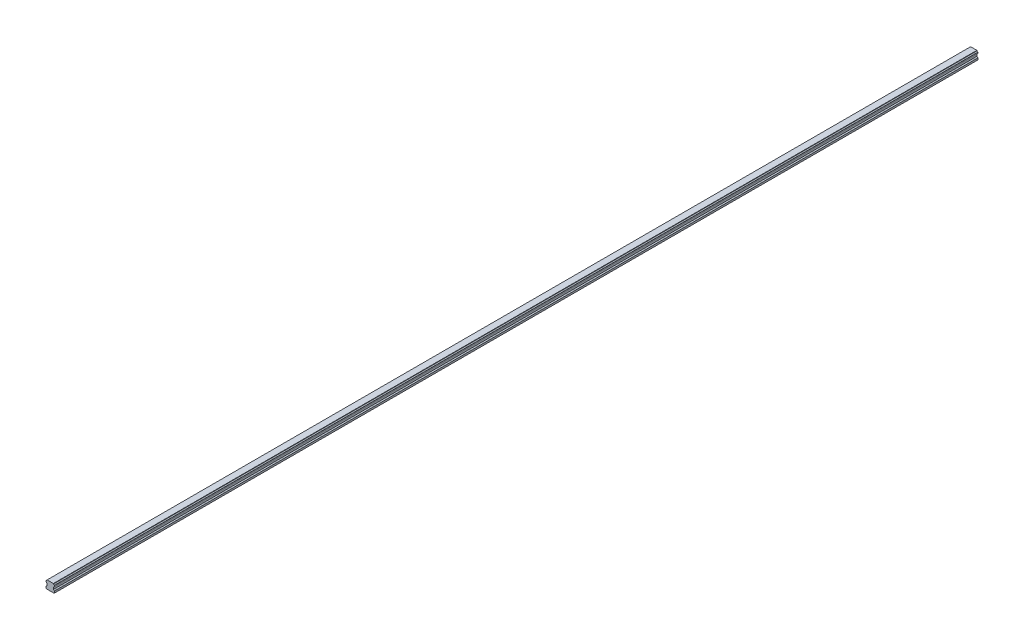
ISO-10303-21;
HEADER;
FILE_DESCRIPTION(('STEP AP214'),'2;1');
FILE_NAME('part.step','',(''),(''),'','','');
FILE_SCHEMA(('AUTOMOTIVE_DESIGN { 1 0 10303 214 1 1 1 1 }'));
ENDSEC;
DATA;
#1=APPLICATION_CONTEXT('core data for automotive mechanical design processes');
#2=APPLICATION_PROTOCOL_DEFINITION('international standard','automotive_design',2000,#1);
#3=PRODUCT_CONTEXT('',#1,'mechanical');
#4=PRODUCT('Part','Part','',(#3));
#5=PRODUCT_RELATED_PRODUCT_CATEGORY('part','',(#4));
#6=PRODUCT_DEFINITION_FORMATION('','',#4);
#7=PRODUCT_DEFINITION_CONTEXT('part definition',#1,'design');
#8=PRODUCT_DEFINITION('design','',#6,#7);
#9=PRODUCT_DEFINITION_SHAPE('','',#8);
#10=(LENGTH_UNIT() NAMED_UNIT(*) SI_UNIT(.MILLI.,.METRE.));
#11=(NAMED_UNIT(*) PLANE_ANGLE_UNIT() SI_UNIT($,.RADIAN.));
#12=(NAMED_UNIT(*) SI_UNIT($,.STERADIAN.) SOLID_ANGLE_UNIT());
#13=UNCERTAINTY_MEASURE_WITH_UNIT(LENGTH_MEASURE(1.E-05),#10,'distance_accuracy_value','');
#14=(GEOMETRIC_REPRESENTATION_CONTEXT(3) GLOBAL_UNCERTAINTY_ASSIGNED_CONTEXT((#13)) GLOBAL_UNIT_ASSIGNED_CONTEXT((#10,
#11,#12)) REPRESENTATION_CONTEXT('',''));
#15=CARTESIAN_POINT('',(0.,0.,0.));
#16=DIRECTION('',(0.,0.,1.));
#17=DIRECTION('',(1.,0.,0.));
#18=AXIS2_PLACEMENT_3D('',#15,#16,#17);
#19=CARTESIAN_POINT('',(11.4999999999682,2.31299423153181,-2500.));
#20=DIRECTION('',(0.,0.,1.));
#21=DIRECTION('',(1.,0.,0.));
#22=AXIS2_PLACEMENT_3D('',#19,#20,#21);
#23=CYLINDRICAL_SURFACE('',#22,2.5);
#24=CARTESIAN_POINT('',(11.4999999999682,2.31299423153181,0.));
#25=DIRECTION('',(0.,0.,-1.));
#26=DIRECTION('',(1.,0.,0.));
#27=AXIS2_PLACEMENT_3D('',#24,#25,#26);
#28=CIRCLE('',#27,2.5);
#29=CARTESIAN_POINT('',(9.0075845864,2.5075845864,0.));
#30=VERTEX_POINT('',#29);
#31=CARTESIAN_POINT('',(11.3054096451,4.8054096451,0.));
#32=VERTEX_POINT('',#31);
#33=EDGE_CURVE('E228',#30,#32,#28,.T.);
#34=ORIENTED_EDGE('',*,*,#33,.F.);
#35=DIRECTION('',(0.,0.,1.));
#36=VECTOR('',#35,1.);
#37=CARTESIAN_POINT('',(9.0075845864,2.5075845864,-2500.));
#38=LINE('',#37,#36);
#39=CARTESIAN_POINT('',(9.0075845864,2.5075845864,-2500.));
#40=VERTEX_POINT('',#39);
#41=EDGE_CURVE('E11',#40,#30,#38,.T.);
#42=ORIENTED_EDGE('',*,*,#41,.F.);
#43=CARTESIAN_POINT('',(11.4999999999682,2.31299423153181,-2500.));
#44=DIRECTION('',(0.,0.,-1.));
#45=DIRECTION('',(1.,0.,0.));
#46=AXIS2_PLACEMENT_3D('',#43,#44,#45);
#47=CIRCLE('',#46,2.5);
#48=CARTESIAN_POINT('',(11.3054096451,4.8054096451,-2500.));
#49=VERTEX_POINT('',#48);
#50=EDGE_CURVE('E296',#40,#49,#47,.T.);
#51=ORIENTED_EDGE('',*,*,#50,.T.);
#52=DIRECTION('',(0.,0.,1.));
#53=VECTOR('',#52,1.);
#54=CARTESIAN_POINT('',(11.3054096451,4.8054096451,-2500.));
#55=LINE('',#54,#53);
#56=EDGE_CURVE('E38',#49,#32,#55,.T.);
#57=ORIENTED_EDGE('',*,*,#56,.T.);
#58=EDGE_LOOP('',(#34,#42,#51,#57));
#59=FACE_BOUND('',#58,.T.);
#60=ADVANCED_FACE('F35',(#59),#23,.F.);
#61=CARTESIAN_POINT('',(8.5,2.,-2500.));
#62=DIRECTION('',(0.707106781186548,-0.707106781186547,0.));
#63=DIRECTION('',(0.707106781186547,0.707106781186548,0.));
#64=AXIS2_PLACEMENT_3D('',#61,#62,#63);
#65=PLANE('',#64);
#66=DIRECTION('',(0.707106781186547,0.707106781186548,0.));
#67=VECTOR('',#66,1.);
#68=CARTESIAN_POINT('',(8.5,2.,0.));
#69=LINE('',#68,#67);
#70=CARTESIAN_POINT('',(8.5,2.,0.));
#71=VERTEX_POINT('',#70);
#72=EDGE_CURVE('E294',#71,#30,#69,.T.);
#73=ORIENTED_EDGE('',*,*,#72,.F.);
#74=DIRECTION('',(0.,0.,1.));
#75=VECTOR('',#74,1.);
#76=CARTESIAN_POINT('',(8.5,2.,-2500.));
#77=LINE('',#76,#75);
#78=CARTESIAN_POINT('',(8.5,2.,-2500.));
#79=VERTEX_POINT('',#78);
#80=EDGE_CURVE('E44',#79,#71,#77,.T.);
#81=ORIENTED_EDGE('',*,*,#80,.F.);
#82=DIRECTION('',(0.707106781186547,0.707106781186548,0.));
#83=VECTOR('',#82,1.);
#84=CARTESIAN_POINT('',(8.5,2.,-2500.));
#85=LINE('',#84,#83);
#86=EDGE_CURVE('E218',#79,#40,#85,.T.);
#87=ORIENTED_EDGE('',*,*,#86,.T.);
#88=ORIENTED_EDGE('',*,*,#41,.T.);
#89=EDGE_LOOP('',(#73,#81,#87,#88));
#90=FACE_BOUND('',#89,.T.);
#91=ADVANCED_FACE('F340',(#90),#65,.T.);
#92=CARTESIAN_POINT('',(8.5,-3.,-2500.));
#93=DIRECTION('',(1.,0.,0.));
#94=DIRECTION('',(0.,0.,-1.));
#95=AXIS2_PLACEMENT_3D('',#92,#93,#94);
#96=PLANE('',#95);
#97=DIRECTION('',(0.,1.,0.));
#98=VECTOR('',#97,1.);
#99=CARTESIAN_POINT('',(8.5,-3.,0.));
#100=LINE('',#99,#98);
#101=CARTESIAN_POINT('',(8.5,-3.,0.));
#102=VERTEX_POINT('',#101);
#103=EDGE_CURVE('E205',#102,#71,#100,.T.);
#104=ORIENTED_EDGE('',*,*,#103,.F.);
#105=DIRECTION('',(0.,0.,1.));
#106=VECTOR('',#105,1.);
#107=CARTESIAN_POINT('',(8.5,-3.,-2500.));
#108=LINE('',#107,#106);
#109=CARTESIAN_POINT('',(8.5,-3.,-2500.));
#110=VERTEX_POINT('',#109);
#111=EDGE_CURVE('E200',#110,#102,#108,.T.);
#112=ORIENTED_EDGE('',*,*,#111,.F.);
#113=DIRECTION('',(0.,1.,0.));
#114=VECTOR('',#113,1.);
#115=CARTESIAN_POINT('',(8.5,-3.,-2500.));
#116=LINE('',#115,#114);
#117=EDGE_CURVE('E203',#110,#79,#116,.T.);
#118=ORIENTED_EDGE('',*,*,#117,.T.);
#119=ORIENTED_EDGE('',*,*,#80,.T.);
#120=EDGE_LOOP('',(#104,#112,#118,#119));
#121=FACE_BOUND('',#120,.T.);
#122=ADVANCED_FACE('F202',(#121),#96,.T.);
#123=CARTESIAN_POINT('',(11.5,-5.,-2500.));
#124=DIRECTION('',(0.554700196225229,0.832050294337844,0.));
#125=DIRECTION('',(-0.832050294337844,0.554700196225229,0.));
#126=AXIS2_PLACEMENT_3D('',#123,#124,#125);
#127=PLANE('',#126);
#128=DIRECTION('',(-0.832050294337844,0.554700196225229,0.));
#129=VECTOR('',#128,1.);
#130=CARTESIAN_POINT('',(11.5,-5.,0.));
#131=LINE('',#130,#129);
#132=CARTESIAN_POINT('',(11.5,-5.,0.));
#133=VERTEX_POINT('',#132);
#134=EDGE_CURVE('E291',#133,#102,#131,.T.);
#135=ORIENTED_EDGE('',*,*,#134,.F.);
#136=DIRECTION('',(0.,0.,1.));
#137=VECTOR('',#136,1.);
#138=CARTESIAN_POINT('',(11.5,-5.,-2500.));
#139=LINE('',#138,#137);
#140=CARTESIAN_POINT('',(11.5,-5.,-2500.));
#141=VERTEX_POINT('',#140);
#142=EDGE_CURVE('E210',#141,#133,#139,.T.);
#143=ORIENTED_EDGE('',*,*,#142,.F.);
#144=DIRECTION('',(-0.832050294337844,0.554700196225229,0.));
#145=VECTOR('',#144,1.);
#146=CARTESIAN_POINT('',(11.5,-5.,-2500.));
#147=LINE('',#146,#145);
#148=EDGE_CURVE('E216',#141,#110,#147,.T.);
#149=ORIENTED_EDGE('',*,*,#148,.T.);
#150=ORIENTED_EDGE('',*,*,#111,.T.);
#151=EDGE_LOOP('',(#135,#143,#149,#150));
#152=FACE_BOUND('',#151,.T.);
#153=ADVANCED_FACE('F220',(#152),#127,.T.);
#154=CARTESIAN_POINT('',(11.5,-10.,-2500.));
#155=DIRECTION('',(1.,0.,0.));
#156=DIRECTION('',(0.,0.,-1.));
#157=AXIS2_PLACEMENT_3D('',#154,#155,#156);
#158=PLANE('',#157);
#159=DIRECTION('',(0.,1.,0.));
#160=VECTOR('',#159,1.);
#161=CARTESIAN_POINT('',(11.5,-10.,0.));
#162=LINE('',#161,#160);
#163=CARTESIAN_POINT('',(11.5,-10.,0.));
#164=VERTEX_POINT('',#163);
#165=EDGE_CURVE('E288',#164,#133,#162,.T.);
#166=ORIENTED_EDGE('',*,*,#165,.F.);
#167=DIRECTION('',(0.,0.,1.));
#168=VECTOR('',#167,1.);
#169=CARTESIAN_POINT('',(11.5,-10.,-2500.));
#170=LINE('',#169,#168);
#171=CARTESIAN_POINT('',(11.5,-10.,-2500.));
#172=VERTEX_POINT('',#171);
#173=EDGE_CURVE('E300',#172,#164,#170,.T.);
#174=ORIENTED_EDGE('',*,*,#173,.F.);
#175=DIRECTION('',(0.,1.,0.));
#176=VECTOR('',#175,1.);
#177=CARTESIAN_POINT('',(11.5,-10.,-2500.));
#178=LINE('',#177,#176);
#179=EDGE_CURVE('E221',#172,#141,#178,.T.);
#180=ORIENTED_EDGE('',*,*,#179,.T.);
#181=ORIENTED_EDGE('',*,*,#142,.T.);
#182=EDGE_LOOP('',(#166,#174,#180,#181));
#183=FACE_BOUND('',#182,.T.);
#184=ADVANCED_FACE('F353',(#183),#158,.T.);
#185=CARTESIAN_POINT('',(10.5,-11.,-2500.));
#186=DIRECTION('',(0.707106781186547,-0.707106781186547,0.));
#187=DIRECTION('',(0.707106781186548,0.707106781186548,0.));
#188=AXIS2_PLACEMENT_3D('',#185,#186,#187);
#189=PLANE('',#188);
#190=DIRECTION('',(0.707106781186548,0.707106781186548,0.));
#191=VECTOR('',#190,1.);
#192=CARTESIAN_POINT('',(10.5,-11.,0.));
#193=LINE('',#192,#191);
#194=CARTESIAN_POINT('',(10.5,-11.,0.));
#195=VERTEX_POINT('',#194);
#196=EDGE_CURVE('E285',#195,#164,#193,.T.);
#197=ORIENTED_EDGE('',*,*,#196,.F.);
#198=DIRECTION('',(0.,0.,1.));
#199=VECTOR('',#198,1.);
#200=CARTESIAN_POINT('',(10.5,-11.,-2500.));
#201=LINE('',#200,#199);
#202=CARTESIAN_POINT('',(10.5,-11.,-2500.));
#203=VERTEX_POINT('',#202);
#204=EDGE_CURVE('E302',#203,#195,#201,.T.);
#205=ORIENTED_EDGE('',*,*,#204,.F.);
#206=DIRECTION('',(0.707106781186548,0.707106781186548,0.));
#207=VECTOR('',#206,1.);
#208=CARTESIAN_POINT('',(10.5,-11.,-2500.));
#209=LINE('',#208,#207);
#210=EDGE_CURVE('E223',#203,#172,#209,.T.);
#211=ORIENTED_EDGE('',*,*,#210,.T.);
#212=ORIENTED_EDGE('',*,*,#173,.T.);
#213=EDGE_LOOP('',(#197,#205,#211,#212));
#214=FACE_BOUND('',#213,.T.);
#215=ADVANCED_FACE('F356',(#214),#189,.T.);
#216=CARTESIAN_POINT('',(-10.5,-11.,-2500.));
#217=DIRECTION('',(0.,-1.,0.));
#218=DIRECTION('',(0.,0.,-1.));
#219=AXIS2_PLACEMENT_3D('',#216,#217,#218);
#220=PLANE('',#219);
#221=DIRECTION('',(1.,0.,0.));
#222=VECTOR('',#221,1.);
#223=CARTESIAN_POINT('',(-10.5,-11.,0.));
#224=LINE('',#223,#222);
#225=CARTESIAN_POINT('',(-10.5,-11.,0.));
#226=VERTEX_POINT('',#225);
#227=EDGE_CURVE('E282',#226,#195,#224,.T.);
#228=ORIENTED_EDGE('',*,*,#227,.F.);
#229=DIRECTION('',(0.,0.,1.));
#230=VECTOR('',#229,1.);
#231=CARTESIAN_POINT('',(-10.5,-11.,-2500.));
#232=LINE('',#231,#230);
#233=CARTESIAN_POINT('',(-10.5,-11.,-2500.));
#234=VERTEX_POINT('',#233);
#235=EDGE_CURVE('E304',#234,#226,#232,.T.);
#236=ORIENTED_EDGE('',*,*,#235,.F.);
#237=DIRECTION('',(1.,0.,0.));
#238=VECTOR('',#237,1.);
#239=CARTESIAN_POINT('',(-10.5,-11.,-2500.));
#240=LINE('',#239,#238);
#241=EDGE_CURVE('E646',#234,#203,#240,.T.);
#242=ORIENTED_EDGE('',*,*,#241,.T.);
#243=ORIENTED_EDGE('',*,*,#204,.T.);
#244=EDGE_LOOP('',(#228,#236,#242,#243));
#245=FACE_BOUND('',#244,.T.);
#246=ADVANCED_FACE('F360',(#245),#220,.T.);
#247=CARTESIAN_POINT('',(-11.5,-10.,-2500.));
#248=DIRECTION('',(-0.707106781186547,-0.707106781186547,0.));
#249=DIRECTION('',(0.707106781186548,-0.707106781186548,0.));
#250=AXIS2_PLACEMENT_3D('',#247,#248,#249);
#251=PLANE('',#250);
#252=DIRECTION('',(0.707106781186548,-0.707106781186548,0.));
#253=VECTOR('',#252,1.);
#254=CARTESIAN_POINT('',(-11.5,-10.,0.));
#255=LINE('',#254,#253);
#256=CARTESIAN_POINT('',(-11.5,-10.,0.));
#257=VERTEX_POINT('',#256);
#258=EDGE_CURVE('E279',#257,#226,#255,.T.);
#259=ORIENTED_EDGE('',*,*,#258,.F.);
#260=DIRECTION('',(0.,0.,1.));
#261=VECTOR('',#260,1.);
#262=CARTESIAN_POINT('',(-11.5,-10.,-2500.));
#263=LINE('',#262,#261);
#264=CARTESIAN_POINT('',(-11.5,-10.,-2500.));
#265=VERTEX_POINT('',#264);
#266=EDGE_CURVE('E306',#265,#257,#263,.T.);
#267=ORIENTED_EDGE('',*,*,#266,.F.);
#268=DIRECTION('',(0.707106781186548,-0.707106781186548,0.));
#269=VECTOR('',#268,1.);
#270=CARTESIAN_POINT('',(-11.5,-10.,-2500.));
#271=LINE('',#270,#269);
#272=EDGE_CURVE('E650',#265,#234,#271,.T.);
#273=ORIENTED_EDGE('',*,*,#272,.T.);
#274=ORIENTED_EDGE('',*,*,#235,.T.);
#275=EDGE_LOOP('',(#259,#267,#273,#274));
#276=FACE_BOUND('',#275,.T.);
#277=ADVANCED_FACE('F364',(#276),#251,.T.);
#278=CARTESIAN_POINT('',(-11.5,-5.,-2500.));
#279=DIRECTION('',(-1.,0.,0.));
#280=DIRECTION('',(0.,0.,1.));
#281=AXIS2_PLACEMENT_3D('',#278,#279,#280);
#282=PLANE('',#281);
#283=DIRECTION('',(0.,-1.,0.));
#284=VECTOR('',#283,1.);
#285=CARTESIAN_POINT('',(-11.5,-5.,0.));
#286=LINE('',#285,#284);
#287=CARTESIAN_POINT('',(-11.5,-5.,0.));
#288=VERTEX_POINT('',#287);
#289=EDGE_CURVE('E276',#288,#257,#286,.T.);
#290=ORIENTED_EDGE('',*,*,#289,.F.);
#291=DIRECTION('',(0.,0.,1.));
#292=VECTOR('',#291,1.);
#293=CARTESIAN_POINT('',(-11.5,-5.,-2500.));
#294=LINE('',#293,#292);
#295=CARTESIAN_POINT('',(-11.5,-5.,-2500.));
#296=VERTEX_POINT('',#295);
#297=EDGE_CURVE('E308',#296,#288,#294,.T.);
#298=ORIENTED_EDGE('',*,*,#297,.F.);
#299=DIRECTION('',(0.,-1.,0.));
#300=VECTOR('',#299,1.);
#301=CARTESIAN_POINT('',(-11.5,-5.,-2500.));
#302=LINE('',#301,#300);
#303=EDGE_CURVE('E639',#296,#265,#302,.T.);
#304=ORIENTED_EDGE('',*,*,#303,.T.);
#305=ORIENTED_EDGE('',*,*,#266,.T.);
#306=EDGE_LOOP('',(#290,#298,#304,#305));
#307=FACE_BOUND('',#306,.T.);
#308=ADVANCED_FACE('F368',(#307),#282,.T.);
#309=CARTESIAN_POINT('',(-8.5,-3.,-2500.));
#310=DIRECTION('',(-0.554700196225229,0.832050294337844,0.));
#311=DIRECTION('',(-0.832050294337844,-0.554700196225229,0.));
#312=AXIS2_PLACEMENT_3D('',#309,#310,#311);
#313=PLANE('',#312);
#314=DIRECTION('',(-0.832050294337844,-0.554700196225229,0.));
#315=VECTOR('',#314,1.);
#316=CARTESIAN_POINT('',(-8.5,-3.,0.));
#317=LINE('',#316,#315);
#318=CARTESIAN_POINT('',(-8.5,-3.,0.));
#319=VERTEX_POINT('',#318);
#320=EDGE_CURVE('E273',#319,#288,#317,.T.);
#321=ORIENTED_EDGE('',*,*,#320,.F.);
#322=DIRECTION('',(0.,0.,1.));
#323=VECTOR('',#322,1.);
#324=CARTESIAN_POINT('',(-8.5,-3.,-2500.));
#325=LINE('',#324,#323);
#326=CARTESIAN_POINT('',(-8.5,-3.,-2500.));
#327=VERTEX_POINT('',#326);
#328=EDGE_CURVE('E310',#327,#319,#325,.T.);
#329=ORIENTED_EDGE('',*,*,#328,.F.);
#330=DIRECTION('',(-0.832050294337844,-0.554700196225229,0.));
#331=VECTOR('',#330,1.);
#332=CARTESIAN_POINT('',(-8.5,-3.,-2500.));
#333=LINE('',#332,#331);
#334=EDGE_CURVE('E635',#327,#296,#333,.T.);
#335=ORIENTED_EDGE('',*,*,#334,.T.);
#336=ORIENTED_EDGE('',*,*,#297,.T.);
#337=EDGE_LOOP('',(#321,#329,#335,#336));
#338=FACE_BOUND('',#337,.T.);
#339=ADVANCED_FACE('F372',(#338),#313,.T.);
#340=CARTESIAN_POINT('',(-8.5,2.,-2500.));
#341=DIRECTION('',(-1.,0.,0.));
#342=DIRECTION('',(0.,0.,1.));
#343=AXIS2_PLACEMENT_3D('',#340,#341,#342);
#344=PLANE('',#343);
#345=DIRECTION('',(0.,-1.,0.));
#346=VECTOR('',#345,1.);
#347=CARTESIAN_POINT('',(-8.5,2.,0.));
#348=LINE('',#347,#346);
#349=CARTESIAN_POINT('',(-8.5,2.,0.));
#350=VERTEX_POINT('',#349);
#351=EDGE_CURVE('E270',#350,#319,#348,.T.);
#352=ORIENTED_EDGE('',*,*,#351,.F.);
#353=DIRECTION('',(0.,0.,1.));
#354=VECTOR('',#353,1.);
#355=CARTESIAN_POINT('',(-8.5,2.,-2500.));
#356=LINE('',#355,#354);
#357=CARTESIAN_POINT('',(-8.5,2.,-2500.));
#358=VERTEX_POINT('',#357);
#359=EDGE_CURVE('E312',#358,#350,#356,.T.);
#360=ORIENTED_EDGE('',*,*,#359,.F.);
#361=DIRECTION('',(0.,-1.,0.));
#362=VECTOR('',#361,1.);
#363=CARTESIAN_POINT('',(-8.5,2.,-2500.));
#364=LINE('',#363,#362);
#365=EDGE_CURVE('E656',#358,#327,#364,.T.);
#366=ORIENTED_EDGE('',*,*,#365,.T.);
#367=ORIENTED_EDGE('',*,*,#328,.T.);
#368=EDGE_LOOP('',(#352,#360,#366,#367));
#369=FACE_BOUND('',#368,.T.);
#370=ADVANCED_FACE('F376',(#369),#344,.T.);
#371=CARTESIAN_POINT('',(-9.0075845864,2.5075845864,-2500.));
#372=DIRECTION('',(-0.707106781186548,-0.707106781186547,0.));
#373=DIRECTION('',(0.707106781186547,-0.707106781186548,0.));
#374=AXIS2_PLACEMENT_3D('',#371,#372,#373);
#375=PLANE('',#374);
#376=DIRECTION('',(0.707106781186547,-0.707106781186548,0.));
#377=VECTOR('',#376,1.);
#378=CARTESIAN_POINT('',(-9.0075845864,2.5075845864,0.));
#379=LINE('',#378,#377);
#380=CARTESIAN_POINT('',(-9.0075845864,2.5075845864,0.));
#381=VERTEX_POINT('',#380);
#382=EDGE_CURVE('E267',#381,#350,#379,.T.);
#383=ORIENTED_EDGE('',*,*,#382,.F.);
#384=DIRECTION('',(0.,0.,1.));
#385=VECTOR('',#384,1.);
#386=CARTESIAN_POINT('',(-9.0075845864,2.5075845864,-2500.));
#387=LINE('',#386,#385);
#388=CARTESIAN_POINT('',(-9.0075845864,2.5075845864,-2500.));
#389=VERTEX_POINT('',#388);
#390=EDGE_CURVE('E314',#389,#381,#387,.T.);
#391=ORIENTED_EDGE('',*,*,#390,.F.);
#392=DIRECTION('',(0.707106781186547,-0.707106781186548,0.));
#393=VECTOR('',#392,1.);
#394=CARTESIAN_POINT('',(-9.0075845864,2.5075845864,-2500.));
#395=LINE('',#394,#393);
#396=EDGE_CURVE('E628',#389,#358,#395,.T.);
#397=ORIENTED_EDGE('',*,*,#396,.T.);
#398=ORIENTED_EDGE('',*,*,#359,.T.);
#399=EDGE_LOOP('',(#383,#391,#397,#398));
#400=FACE_BOUND('',#399,.T.);
#401=ADVANCED_FACE('F380',(#400),#375,.T.);
#402=CARTESIAN_POINT('',(-11.4999999999682,2.31299423153181,-2500.));
#403=DIRECTION('',(0.,0.,1.));
#404=DIRECTION('',(1.,0.,0.));
#405=AXIS2_PLACEMENT_3D('',#402,#403,#404);
#406=CYLINDRICAL_SURFACE('',#405,2.5);
#407=CARTESIAN_POINT('',(-11.4999999999682,2.31299423153181,0.));
#408=DIRECTION('',(0.,0.,-1.));
#409=DIRECTION('',(1.,0.,0.));
#410=AXIS2_PLACEMENT_3D('',#407,#408,#409);
#411=CIRCLE('',#410,2.5);
#412=CARTESIAN_POINT('',(-11.3054096451,4.8054096451,0.));
#413=VERTEX_POINT('',#412);
#414=EDGE_CURVE('E264',#413,#381,#411,.T.);
#415=ORIENTED_EDGE('',*,*,#414,.F.);
#416=DIRECTION('',(0.,0.,1.));
#417=VECTOR('',#416,1.);
#418=CARTESIAN_POINT('',(-11.3054096451,4.8054096451,-2500.));
#419=LINE('',#418,#417);
#420=CARTESIAN_POINT('',(-11.3054096451,4.8054096451,-2500.));
#421=VERTEX_POINT('',#420);
#422=EDGE_CURVE('E316',#421,#413,#419,.T.);
#423=ORIENTED_EDGE('',*,*,#422,.F.);
#424=CARTESIAN_POINT('',(-11.4999999999682,2.31299423153181,-2500.));
#425=DIRECTION('',(0.,0.,-1.));
#426=DIRECTION('',(1.,0.,0.));
#427=AXIS2_PLACEMENT_3D('',#424,#425,#426);
#428=CIRCLE('',#427,2.5);
#429=EDGE_CURVE('E624',#421,#389,#428,.T.);
#430=ORIENTED_EDGE('',*,*,#429,.T.);
#431=ORIENTED_EDGE('',*,*,#390,.T.);
#432=EDGE_LOOP('',(#415,#423,#430,#431));
#433=FACE_BOUND('',#432,.T.);
#434=ADVANCED_FACE('F384',(#433),#406,.F.);
#435=CARTESIAN_POINT('',(-11.5,5.,-2500.));
#436=DIRECTION('',(-0.707106781186548,-0.707106781186548,0.));
#437=DIRECTION('',(0.707106781186548,-0.707106781186548,0.));
#438=AXIS2_PLACEMENT_3D('',#435,#436,#437);
#439=PLANE('',#438);
#440=DIRECTION('',(0.707106781186548,-0.707106781186548,0.));
#441=VECTOR('',#440,1.);
#442=CARTESIAN_POINT('',(-11.5,5.,0.));
#443=LINE('',#442,#441);
#444=CARTESIAN_POINT('',(-11.5,5.,0.));
#445=VERTEX_POINT('',#444);
#446=EDGE_CURVE('E261',#445,#413,#443,.T.);
#447=ORIENTED_EDGE('',*,*,#446,.F.);
#448=DIRECTION('',(0.,0.,1.));
#449=VECTOR('',#448,1.);
#450=CARTESIAN_POINT('',(-11.5,5.,-2500.));
#451=LINE('',#450,#449);
#452=CARTESIAN_POINT('',(-11.5,5.,-2500.));
#453=VERTEX_POINT('',#452);
#454=EDGE_CURVE('E318',#453,#445,#451,.T.);
#455=ORIENTED_EDGE('',*,*,#454,.F.);
#456=DIRECTION('',(0.707106781186548,-0.707106781186548,0.));
#457=VECTOR('',#456,1.);
#458=CARTESIAN_POINT('',(-11.5,5.,-2500.));
#459=LINE('',#458,#457);
#460=EDGE_CURVE('E660',#453,#421,#459,.T.);
#461=ORIENTED_EDGE('',*,*,#460,.T.);
#462=ORIENTED_EDGE('',*,*,#422,.T.);
#463=EDGE_LOOP('',(#447,#455,#461,#462));
#464=FACE_BOUND('',#463,.T.);
#465=ADVANCED_FACE('F388',(#464),#439,.T.);
#466=CARTESIAN_POINT('',(-11.5,8.,-2500.));
#467=DIRECTION('',(-1.,0.,0.));
#468=DIRECTION('',(0.,0.,1.));
#469=AXIS2_PLACEMENT_3D('',#466,#467,#468);
#470=PLANE('',#469);
#471=DIRECTION('',(0.,-1.,0.));
#472=VECTOR('',#471,1.);
#473=CARTESIAN_POINT('',(-11.5,8.,0.));
#474=LINE('',#473,#472);
#475=CARTESIAN_POINT('',(-11.5,8.,0.));
#476=VERTEX_POINT('',#475);
#477=EDGE_CURVE('E258',#476,#445,#474,.T.);
#478=ORIENTED_EDGE('',*,*,#477,.F.);
#479=DIRECTION('',(0.,0.,1.));
#480=VECTOR('',#479,1.);
#481=CARTESIAN_POINT('',(-11.5,8.,-2500.));
#482=LINE('',#481,#480);
#483=CARTESIAN_POINT('',(-11.5,8.,-2500.));
#484=VERTEX_POINT('',#483);
#485=EDGE_CURVE('E320',#484,#476,#482,.T.);
#486=ORIENTED_EDGE('',*,*,#485,.F.);
#487=DIRECTION('',(0.,-1.,0.));
#488=VECTOR('',#487,1.);
#489=CARTESIAN_POINT('',(-11.5,8.,-2500.));
#490=LINE('',#489,#488);
#491=EDGE_CURVE('E617',#484,#453,#490,.T.);
#492=ORIENTED_EDGE('',*,*,#491,.T.);
#493=ORIENTED_EDGE('',*,*,#454,.T.);
#494=EDGE_LOOP('',(#478,#486,#492,#493));
#495=FACE_BOUND('',#494,.T.);
#496=ADVANCED_FACE('F392',(#495),#470,.T.);
#497=CARTESIAN_POINT('',(-11.3054096451,8.1945903549,-2500.));
#498=DIRECTION('',(-0.707106781186551,0.707106781186544,0.));
#499=DIRECTION('',(-0.707106781186544,-0.707106781186551,0.));
#500=AXIS2_PLACEMENT_3D('',#497,#498,#499);
#501=PLANE('',#500);
#502=DIRECTION('',(-0.707106781186544,-0.707106781186551,0.));
#503=VECTOR('',#502,1.);
#504=CARTESIAN_POINT('',(-11.3054096451,8.1945903549,0.));
#505=LINE('',#504,#503);
#506=CARTESIAN_POINT('',(-11.3054096451,8.1945903549,0.));
#507=VERTEX_POINT('',#506);
#508=EDGE_CURVE('E255',#507,#476,#505,.T.);
#509=ORIENTED_EDGE('',*,*,#508,.F.);
#510=DIRECTION('',(0.,0.,1.));
#511=VECTOR('',#510,1.);
#512=CARTESIAN_POINT('',(-11.3054096451,8.1945903549,-2500.));
#513=LINE('',#512,#511);
#514=CARTESIAN_POINT('',(-11.3054096451,8.1945903549,-2500.));
#515=VERTEX_POINT('',#514);
#516=EDGE_CURVE('E322',#515,#507,#513,.T.);
#517=ORIENTED_EDGE('',*,*,#516,.F.);
#518=DIRECTION('',(-0.707106781186544,-0.707106781186551,0.));
#519=VECTOR('',#518,1.);
#520=CARTESIAN_POINT('',(-11.3054096451,8.1945903549,-2500.));
#521=LINE('',#520,#519);
#522=EDGE_CURVE('E613',#515,#484,#521,.T.);
#523=ORIENTED_EDGE('',*,*,#522,.T.);
#524=ORIENTED_EDGE('',*,*,#485,.T.);
#525=EDGE_LOOP('',(#509,#517,#523,#524));
#526=FACE_BOUND('',#525,.T.);
#527=ADVANCED_FACE('F396',(#526),#501,.T.);
#528=CARTESIAN_POINT('',(-11.4999999999682,10.6870057684682,-2500.));
#529=DIRECTION('',(0.,0.,1.));
#530=DIRECTION('',(1.,0.,0.));
#531=AXIS2_PLACEMENT_3D('',#528,#529,#530);
#532=CYLINDRICAL_SURFACE('',#531,2.5);
#533=CARTESIAN_POINT('',(-11.4999999999682,10.6870057684682,0.));
#534=DIRECTION('',(0.,0.,-1.));
#535=DIRECTION('',(1.,0.,0.));
#536=AXIS2_PLACEMENT_3D('',#533,#534,#535);
#537=CIRCLE('',#536,2.5);
#538=CARTESIAN_POINT('',(-9.0075845864,10.4924154136,0.));
#539=VERTEX_POINT('',#538);
#540=EDGE_CURVE('E252',#539,#507,#537,.T.);
#541=ORIENTED_EDGE('',*,*,#540,.F.);
#542=DIRECTION('',(0.,0.,1.));
#543=VECTOR('',#542,1.);
#544=CARTESIAN_POINT('',(-9.0075845864,10.4924154136,-2500.));
#545=LINE('',#544,#543);
#546=CARTESIAN_POINT('',(-9.0075845864,10.4924154136,-2500.));
#547=VERTEX_POINT('',#546);
#548=EDGE_CURVE('E324',#547,#539,#545,.T.);
#549=ORIENTED_EDGE('',*,*,#548,.F.);
#550=CARTESIAN_POINT('',(-11.4999999999682,10.6870057684682,-2500.));
#551=DIRECTION('',(0.,0.,-1.));
#552=DIRECTION('',(1.,0.,0.));
#553=AXIS2_PLACEMENT_3D('',#550,#551,#552);
#554=CIRCLE('',#553,2.5);
#555=EDGE_CURVE('E664',#547,#515,#554,.T.);
#556=ORIENTED_EDGE('',*,*,#555,.T.);
#557=ORIENTED_EDGE('',*,*,#516,.T.);
#558=EDGE_LOOP('',(#541,#549,#556,#557));
#559=FACE_BOUND('',#558,.T.);
#560=ADVANCED_FACE('F400',(#559),#532,.F.);
#561=CARTESIAN_POINT('',(-8.5,11.,-2500.));
#562=DIRECTION('',(-0.707106781186548,0.707106781186548,0.));
#563=DIRECTION('',(-0.707106781186548,-0.707106781186548,0.));
#564=AXIS2_PLACEMENT_3D('',#561,#562,#563);
#565=PLANE('',#564);
#566=DIRECTION('',(-0.707106781186548,-0.707106781186548,0.));
#567=VECTOR('',#566,1.);
#568=CARTESIAN_POINT('',(-8.5,11.,0.));
#569=LINE('',#568,#567);
#570=CARTESIAN_POINT('',(-8.5,11.,0.));
#571=VERTEX_POINT('',#570);
#572=EDGE_CURVE('E249',#571,#539,#569,.T.);
#573=ORIENTED_EDGE('',*,*,#572,.F.);
#574=DIRECTION('',(0.,0.,1.));
#575=VECTOR('',#574,1.);
#576=CARTESIAN_POINT('',(-8.5,11.,-2500.));
#577=LINE('',#576,#575);
#578=CARTESIAN_POINT('',(-8.5,11.,-2500.));
#579=VERTEX_POINT('',#578);
#580=EDGE_CURVE('E326',#579,#571,#577,.T.);
#581=ORIENTED_EDGE('',*,*,#580,.F.);
#582=DIRECTION('',(-0.707106781186548,-0.707106781186548,0.));
#583=VECTOR('',#582,1.);
#584=CARTESIAN_POINT('',(-8.5,11.,-2500.));
#585=LINE('',#584,#583);
#586=EDGE_CURVE('E606',#579,#547,#585,.T.);
#587=ORIENTED_EDGE('',*,*,#586,.T.);
#588=ORIENTED_EDGE('',*,*,#548,.T.);
#589=EDGE_LOOP('',(#573,#581,#587,#588));
#590=FACE_BOUND('',#589,.T.);
#591=ADVANCED_FACE('F404',(#590),#565,.T.);
#592=CARTESIAN_POINT('',(8.5,11.,-2500.));
#593=DIRECTION('',(0.,1.,0.));
#594=DIRECTION('',(0.,0.,1.));
#595=AXIS2_PLACEMENT_3D('',#592,#593,#594);
#596=PLANE('',#595);
#597=DIRECTION('',(-1.,0.,0.));
#598=VECTOR('',#597,1.);
#599=CARTESIAN_POINT('',(8.5,11.,0.));
#600=LINE('',#599,#598);
#601=CARTESIAN_POINT('',(8.5,11.,0.));
#602=VERTEX_POINT('',#601);
#603=EDGE_CURVE('E246',#602,#571,#600,.T.);
#604=ORIENTED_EDGE('',*,*,#603,.F.);
#605=DIRECTION('',(0.,0.,1.));
#606=VECTOR('',#605,1.);
#607=CARTESIAN_POINT('',(8.5,11.,-2500.));
#608=LINE('',#607,#606);
#609=CARTESIAN_POINT('',(8.5,11.,-2500.));
#610=VERTEX_POINT('',#609);
#611=EDGE_CURVE('E328',#610,#602,#608,.T.);
#612=ORIENTED_EDGE('',*,*,#611,.F.);
#613=DIRECTION('',(-1.,0.,0.));
#614=VECTOR('',#613,1.);
#615=CARTESIAN_POINT('',(8.5,11.,-2500.));
#616=LINE('',#615,#614);
#617=EDGE_CURVE('E602',#610,#579,#616,.T.);
#618=ORIENTED_EDGE('',*,*,#617,.T.);
#619=ORIENTED_EDGE('',*,*,#580,.T.);
#620=EDGE_LOOP('',(#604,#612,#618,#619));
#621=FACE_BOUND('',#620,.T.);
#622=ADVANCED_FACE('F408',(#621),#596,.T.);
#623=CARTESIAN_POINT('',(9.0075845864,10.4924154136,-2500.));
#624=DIRECTION('',(0.707106781186548,0.707106781186548,0.));
#625=DIRECTION('',(-0.707106781186548,0.707106781186548,0.));
#626=AXIS2_PLACEMENT_3D('',#623,#624,#625);
#627=PLANE('',#626);
#628=DIRECTION('',(-0.707106781186548,0.707106781186548,0.));
#629=VECTOR('',#628,1.);
#630=CARTESIAN_POINT('',(9.0075845864,10.4924154136,0.));
#631=LINE('',#630,#629);
#632=CARTESIAN_POINT('',(9.0075845864,10.4924154136,0.));
#633=VERTEX_POINT('',#632);
#634=EDGE_CURVE('E243',#633,#602,#631,.T.);
#635=ORIENTED_EDGE('',*,*,#634,.F.);
#636=DIRECTION('',(0.,0.,1.));
#637=VECTOR('',#636,1.);
#638=CARTESIAN_POINT('',(9.0075845864,10.4924154136,-2500.));
#639=LINE('',#638,#637);
#640=CARTESIAN_POINT('',(9.0075845864,10.4924154136,-2500.));
#641=VERTEX_POINT('',#640);
#642=EDGE_CURVE('E330',#641,#633,#639,.T.);
#643=ORIENTED_EDGE('',*,*,#642,.F.);
#644=DIRECTION('',(-0.707106781186548,0.707106781186548,0.));
#645=VECTOR('',#644,1.);
#646=CARTESIAN_POINT('',(9.0075845864,10.4924154136,-2500.));
#647=LINE('',#646,#645);
#648=EDGE_CURVE('E668',#641,#610,#647,.T.);
#649=ORIENTED_EDGE('',*,*,#648,.T.);
#650=ORIENTED_EDGE('',*,*,#611,.T.);
#651=EDGE_LOOP('',(#635,#643,#649,#650));
#652=FACE_BOUND('',#651,.T.);
#653=ADVANCED_FACE('F412',(#652),#627,.T.);
#654=CARTESIAN_POINT('',(11.4999999999682,10.6870057684682,-2500.));
#655=DIRECTION('',(0.,0.,1.));
#656=DIRECTION('',(1.,0.,0.));
#657=AXIS2_PLACEMENT_3D('',#654,#655,#656);
#658=CYLINDRICAL_SURFACE('',#657,2.5);
#659=CARTESIAN_POINT('',(11.4999999999682,10.6870057684682,0.));
#660=DIRECTION('',(0.,0.,-1.));
#661=DIRECTION('',(1.,0.,0.));
#662=AXIS2_PLACEMENT_3D('',#659,#660,#661);
#663=CIRCLE('',#662,2.5);
#664=CARTESIAN_POINT('',(11.3054096451,8.1945903549,0.));
#665=VERTEX_POINT('',#664);
#666=EDGE_CURVE('E240',#665,#633,#663,.T.);
#667=ORIENTED_EDGE('',*,*,#666,.F.);
#668=DIRECTION('',(0.,0.,1.));
#669=VECTOR('',#668,1.);
#670=CARTESIAN_POINT('',(11.3054096451,8.1945903549,-2500.));
#671=LINE('',#670,#669);
#672=CARTESIAN_POINT('',(11.3054096451,8.1945903549,-2500.));
#673=VERTEX_POINT('',#672);
#674=EDGE_CURVE('E332',#673,#665,#671,.T.);
#675=ORIENTED_EDGE('',*,*,#674,.F.);
#676=CARTESIAN_POINT('',(11.4999999999682,10.6870057684682,-2500.));
#677=DIRECTION('',(0.,0.,-1.));
#678=DIRECTION('',(1.,0.,0.));
#679=AXIS2_PLACEMENT_3D('',#676,#677,#678);
#680=CIRCLE('',#679,2.5);
#681=EDGE_CURVE('E595',#673,#641,#680,.T.);
#682=ORIENTED_EDGE('',*,*,#681,.T.);
#683=ORIENTED_EDGE('',*,*,#642,.T.);
#684=EDGE_LOOP('',(#667,#675,#682,#683));
#685=FACE_BOUND('',#684,.T.);
#686=ADVANCED_FACE('F416',(#685),#658,.F.);
#687=CARTESIAN_POINT('',(11.5,8.,-2500.));
#688=DIRECTION('',(0.707106781186551,0.707106781186544,0.));
#689=DIRECTION('',(-0.707106781186544,0.707106781186551,0.));
#690=AXIS2_PLACEMENT_3D('',#687,#688,#689);
#691=PLANE('',#690);
#692=DIRECTION('',(-0.707106781186544,0.707106781186551,0.));
#693=VECTOR('',#692,1.);
#694=CARTESIAN_POINT('',(11.5,8.,0.));
#695=LINE('',#694,#693);
#696=CARTESIAN_POINT('',(11.5,8.,0.));
#697=VERTEX_POINT('',#696);
#698=EDGE_CURVE('E237',#697,#665,#695,.T.);
#699=ORIENTED_EDGE('',*,*,#698,.F.);
#700=DIRECTION('',(0.,0.,1.));
#701=VECTOR('',#700,1.);
#702=CARTESIAN_POINT('',(11.5,8.,-2500.));
#703=LINE('',#702,#701);
#704=CARTESIAN_POINT('',(11.5,8.,-2500.));
#705=VERTEX_POINT('',#704);
#706=EDGE_CURVE('E334',#705,#697,#703,.T.);
#707=ORIENTED_EDGE('',*,*,#706,.F.);
#708=DIRECTION('',(-0.707106781186544,0.707106781186551,0.));
#709=VECTOR('',#708,1.);
#710=CARTESIAN_POINT('',(11.5,8.,-2500.));
#711=LINE('',#710,#709);
#712=EDGE_CURVE('E591',#705,#673,#711,.T.);
#713=ORIENTED_EDGE('',*,*,#712,.T.);
#714=ORIENTED_EDGE('',*,*,#674,.T.);
#715=EDGE_LOOP('',(#699,#707,#713,#714));
#716=FACE_BOUND('',#715,.T.);
#717=ADVANCED_FACE('F420',(#716),#691,.T.);
#718=CARTESIAN_POINT('',(11.5,5.,-2500.));
#719=DIRECTION('',(1.,0.,0.));
#720=DIRECTION('',(0.,0.,-1.));
#721=AXIS2_PLACEMENT_3D('',#718,#719,#720);
#722=PLANE('',#721);
#723=DIRECTION('',(0.,1.,0.));
#724=VECTOR('',#723,1.);
#725=CARTESIAN_POINT('',(11.5,5.,0.));
#726=LINE('',#725,#724);
#727=CARTESIAN_POINT('',(11.5,5.,0.));
#728=VERTEX_POINT('',#727);
#729=EDGE_CURVE('E234',#728,#697,#726,.T.);
#730=ORIENTED_EDGE('',*,*,#729,.F.);
#731=DIRECTION('',(0.,0.,1.));
#732=VECTOR('',#731,1.);
#733=CARTESIAN_POINT('',(11.5,5.,-2500.));
#734=LINE('',#733,#732);
#735=CARTESIAN_POINT('',(11.5,5.,-2500.));
#736=VERTEX_POINT('',#735);
#737=EDGE_CURVE('E335',#736,#728,#734,.T.);
#738=ORIENTED_EDGE('',*,*,#737,.F.);
#739=DIRECTION('',(0.,1.,0.));
#740=VECTOR('',#739,1.);
#741=CARTESIAN_POINT('',(11.5,5.,-2500.));
#742=LINE('',#741,#740);
#743=EDGE_CURVE('E672',#736,#705,#742,.T.);
#744=ORIENTED_EDGE('',*,*,#743,.T.);
#745=ORIENTED_EDGE('',*,*,#706,.T.);
#746=EDGE_LOOP('',(#730,#738,#744,#745));
#747=FACE_BOUND('',#746,.T.);
#748=ADVANCED_FACE('F424',(#747),#722,.T.);
#749=CARTESIAN_POINT('',(11.3054096451,4.8054096451,-2500.));
#750=DIRECTION('',(0.707106781186548,-0.707106781186548,0.));
#751=DIRECTION('',(0.707106781186548,0.707106781186548,0.));
#752=AXIS2_PLACEMENT_3D('',#749,#750,#751);
#753=PLANE('',#752);
#754=DIRECTION('',(0.707106781186548,0.707106781186548,0.));
#755=VECTOR('',#754,1.);
#756=CARTESIAN_POINT('',(11.3054096451,4.8054096451,0.));
#757=LINE('',#756,#755);
#758=EDGE_CURVE('E231',#32,#728,#757,.T.);
#759=ORIENTED_EDGE('',*,*,#758,.F.);
#760=ORIENTED_EDGE('',*,*,#56,.F.);
#761=DIRECTION('',(0.707106781186548,0.707106781186548,0.));
#762=VECTOR('',#761,1.);
#763=CARTESIAN_POINT('',(11.3054096451,4.8054096451,-2500.));
#764=LINE('',#763,#762);
#765=EDGE_CURVE('E674',#49,#736,#764,.T.);
#766=ORIENTED_EDGE('',*,*,#765,.T.);
#767=ORIENTED_EDGE('',*,*,#737,.T.);
#768=EDGE_LOOP('',(#759,#760,#766,#767));
#769=FACE_BOUND('',#768,.T.);
#770=ADVANCED_FACE('F337',(#769),#753,.T.);
#771=CARTESIAN_POINT('',(11.4999999999682,2.31299423153181,-2500.));
#772=DIRECTION('',(0.,0.,1.));
#773=DIRECTION('',(1.,0.,0.));
#774=AXIS2_PLACEMENT_3D('',#771,#772,#773);
#775=PLANE('',#774);
#776=ORIENTED_EDGE('',*,*,#50,.F.);
#777=ORIENTED_EDGE('',*,*,#86,.F.);
#778=ORIENTED_EDGE('',*,*,#117,.F.);
#779=ORIENTED_EDGE('',*,*,#148,.F.);
#780=ORIENTED_EDGE('',*,*,#179,.F.);
#781=ORIENTED_EDGE('',*,*,#210,.F.);
#782=ORIENTED_EDGE('',*,*,#241,.F.);
#783=ORIENTED_EDGE('',*,*,#272,.F.);
#784=ORIENTED_EDGE('',*,*,#303,.F.);
#785=ORIENTED_EDGE('',*,*,#334,.F.);
#786=ORIENTED_EDGE('',*,*,#365,.F.);
#787=ORIENTED_EDGE('',*,*,#396,.F.);
#788=ORIENTED_EDGE('',*,*,#429,.F.);
#789=ORIENTED_EDGE('',*,*,#460,.F.);
#790=ORIENTED_EDGE('',*,*,#491,.F.);
#791=ORIENTED_EDGE('',*,*,#522,.F.);
#792=ORIENTED_EDGE('',*,*,#555,.F.);
#793=ORIENTED_EDGE('',*,*,#586,.F.);
#794=ORIENTED_EDGE('',*,*,#617,.F.);
#795=ORIENTED_EDGE('',*,*,#648,.F.);
#796=ORIENTED_EDGE('',*,*,#681,.F.);
#797=ORIENTED_EDGE('',*,*,#712,.F.);
#798=ORIENTED_EDGE('',*,*,#743,.F.);
#799=ORIENTED_EDGE('',*,*,#765,.F.);
#800=EDGE_LOOP('',(#776,#777,#778,#779,#780,#781,#782,#783,#784,#785,#786,#787,#788,#789,#790,
#791,#792,#793,#794,#795,#796,#797,#798,#799));
#801=FACE_BOUND('',#800,.T.);
#802=ADVANCED_FACE('F214',(#801),#775,.F.);
#803=CARTESIAN_POINT('',(11.4999999999682,2.31299423153181,0.));
#804=DIRECTION('',(0.,0.,1.));
#805=DIRECTION('',(1.,0.,0.));
#806=AXIS2_PLACEMENT_3D('',#803,#804,#805);
#807=PLANE('',#806);
#808=ORIENTED_EDGE('',*,*,#33,.T.);
#809=ORIENTED_EDGE('',*,*,#758,.T.);
#810=ORIENTED_EDGE('',*,*,#729,.T.);
#811=ORIENTED_EDGE('',*,*,#698,.T.);
#812=ORIENTED_EDGE('',*,*,#666,.T.);
#813=ORIENTED_EDGE('',*,*,#634,.T.);
#814=ORIENTED_EDGE('',*,*,#603,.T.);
#815=ORIENTED_EDGE('',*,*,#572,.T.);
#816=ORIENTED_EDGE('',*,*,#540,.T.);
#817=ORIENTED_EDGE('',*,*,#508,.T.);
#818=ORIENTED_EDGE('',*,*,#477,.T.);
#819=ORIENTED_EDGE('',*,*,#446,.T.);
#820=ORIENTED_EDGE('',*,*,#414,.T.);
#821=ORIENTED_EDGE('',*,*,#382,.T.);
#822=ORIENTED_EDGE('',*,*,#351,.T.);
#823=ORIENTED_EDGE('',*,*,#320,.T.);
#824=ORIENTED_EDGE('',*,*,#289,.T.);
#825=ORIENTED_EDGE('',*,*,#258,.T.);
#826=ORIENTED_EDGE('',*,*,#227,.T.);
#827=ORIENTED_EDGE('',*,*,#196,.T.);
#828=ORIENTED_EDGE('',*,*,#165,.T.);
#829=ORIENTED_EDGE('',*,*,#134,.T.);
#830=ORIENTED_EDGE('',*,*,#103,.T.);
#831=ORIENTED_EDGE('',*,*,#72,.T.);
#832=EDGE_LOOP('',(#808,#809,#810,#811,#812,#813,#814,#815,#816,#817,#818,#819,#820,#821,#822,
#823,#824,#825,#826,#827,#828,#829,#830,#831));
#833=FACE_BOUND('',#832,.T.);
#834=ADVANCED_FACE('F339',(#833),#807,.T.);
#835=CLOSED_SHELL('',(#60,#91,#122,#153,#184,#215,#246,#277,#308,#339,#370,#401,#434,#465,#496,
#527,#560,#591,#622,#653,#686,#717,#748,#770,#802,#834));
#836=MANIFOLD_SOLID_BREP('B2',#835);
#837=ADVANCED_BREP_SHAPE_REPRESENTATION('',(#18,#836),#14);
#838=SHAPE_DEFINITION_REPRESENTATION(#9,#837);
ENDSEC;
END-ISO-10303-21;
